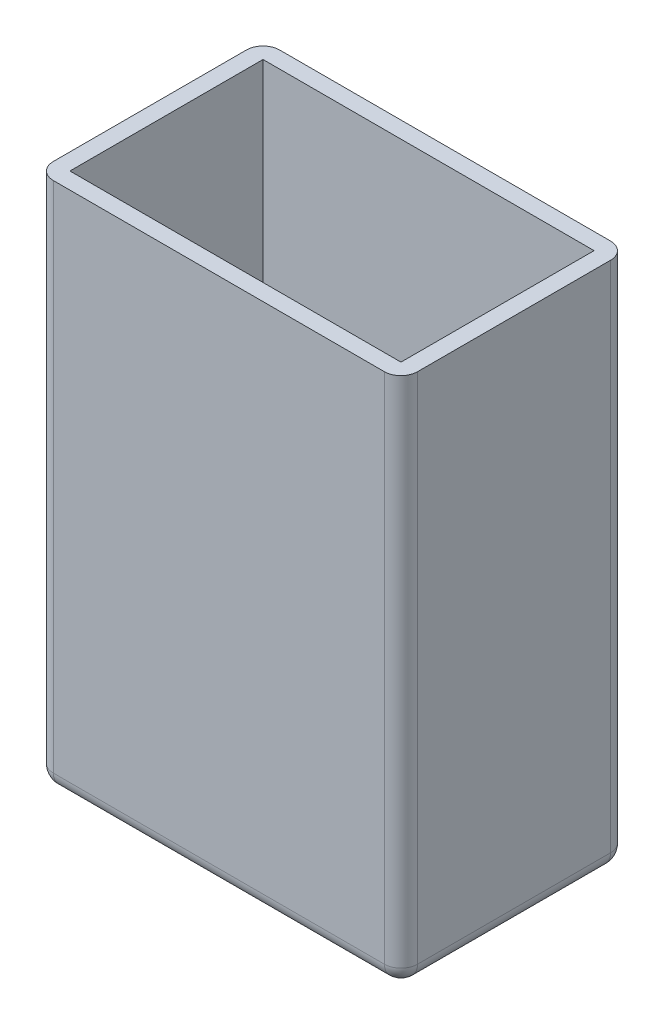
ISO-10303-21;
HEADER;
FILE_DESCRIPTION(('STEP AP214'),'2;1');
FILE_NAME('part.step','',(''),(''),'','','');
FILE_SCHEMA(('AUTOMOTIVE_DESIGN { 1 0 10303 214 1 1 1 1 }'));
ENDSEC;
DATA;
#1=APPLICATION_CONTEXT('core data for automotive mechanical design processes');
#2=APPLICATION_PROTOCOL_DEFINITION('international standard','automotive_design',2000,#1);
#3=PRODUCT_CONTEXT('',#1,'mechanical');
#4=PRODUCT('Part','Part','',(#3));
#5=PRODUCT_RELATED_PRODUCT_CATEGORY('part','',(#4));
#6=PRODUCT_DEFINITION_FORMATION('','',#4);
#7=PRODUCT_DEFINITION_CONTEXT('part definition',#1,'design');
#8=PRODUCT_DEFINITION('design','',#6,#7);
#9=PRODUCT_DEFINITION_SHAPE('','',#8);
#10=(LENGTH_UNIT() NAMED_UNIT(*) SI_UNIT(.MILLI.,.METRE.));
#11=(NAMED_UNIT(*) PLANE_ANGLE_UNIT() SI_UNIT($,.RADIAN.));
#12=(NAMED_UNIT(*) SI_UNIT($,.STERADIAN.) SOLID_ANGLE_UNIT());
#13=UNCERTAINTY_MEASURE_WITH_UNIT(LENGTH_MEASURE(1.E-05),#10,'distance_accuracy_value','');
#14=(GEOMETRIC_REPRESENTATION_CONTEXT(3) GLOBAL_UNCERTAINTY_ASSIGNED_CONTEXT((#13)) GLOBAL_UNIT_ASSIGNED_CONTEXT((#10,
#11,#12)) REPRESENTATION_CONTEXT('',''));
#15=CARTESIAN_POINT('',(0.,0.,0.));
#16=DIRECTION('',(0.,0.,1.));
#17=DIRECTION('',(1.,0.,0.));
#18=AXIS2_PLACEMENT_3D('',#15,#16,#17);
#19=CARTESIAN_POINT('',(0.,0.,3.));
#20=DIRECTION('',(0.,0.,1.));
#21=DIRECTION('',(1.,0.,0.));
#22=AXIS2_PLACEMENT_3D('',#19,#20,#21);
#23=SPHERICAL_SURFACE('',#22,3.);
#24=CARTESIAN_POINT('',(0.,0.,3.));
#25=DIRECTION('',(0.,1.,0.));
#26=DIRECTION('',(0.,0.,1.));
#27=AXIS2_PLACEMENT_3D('',#24,#25,#26);
#28=CIRCLE('',#27,3.);
#29=CARTESIAN_POINT('',(0.,0.,0.));
#30=VERTEX_POINT('',#29);
#31=CARTESIAN_POINT('',(-3.,0.,3.));
#32=VERTEX_POINT('',#31);
#33=EDGE_CURVE('E11',#30,#32,#28,.T.);
#34=ORIENTED_EDGE('',*,*,#33,.F.);
#35=CARTESIAN_POINT('',(0.,0.,3.));
#36=DIRECTION('',(-1.,0.,0.));
#37=DIRECTION('',(0.,0.,1.));
#38=AXIS2_PLACEMENT_3D('',#35,#36,#37);
#39=CIRCLE('',#38,3.);
#40=CARTESIAN_POINT('',(0.,-3.,3.));
#41=VERTEX_POINT('',#40);
#42=EDGE_CURVE('E47',#30,#41,#39,.T.);
#43=ORIENTED_EDGE('',*,*,#42,.T.);
#44=CARTESIAN_POINT('',(0.,0.,3.));
#45=DIRECTION('',(0.,0.,1.));
#46=DIRECTION('',(1.,0.,0.));
#47=AXIS2_PLACEMENT_3D('',#44,#45,#46);
#48=CIRCLE('',#47,3.);
#49=EDGE_CURVE('E263',#32,#41,#48,.T.);
#50=ORIENTED_EDGE('',*,*,#49,.F.);
#51=EDGE_LOOP('',(#34,#43,#50));
#52=FACE_BOUND('',#51,.T.);
#53=ADVANCED_FACE('F39',(#52),#23,.T.);
#54=CARTESIAN_POINT('',(0.,0.,3.));
#55=DIRECTION('',(-1.,0.,0.));
#56=DIRECTION('',(0.,0.,1.));
#57=AXIS2_PLACEMENT_3D('',#54,#55,#56);
#58=CYLINDRICAL_SURFACE('',#57,3.);
#59=ORIENTED_EDGE('',*,*,#42,.F.);
#60=DIRECTION('',(-1.,0.,0.));
#61=VECTOR('',#60,1.);
#62=CARTESIAN_POINT('',(0.,0.,0.));
#63=LINE('',#62,#61);
#64=CARTESIAN_POINT('',(60.,0.,0.));
#65=VERTEX_POINT('',#64);
#66=EDGE_CURVE('E243',#65,#30,#63,.T.);
#67=ORIENTED_EDGE('',*,*,#66,.F.);
#68=CARTESIAN_POINT('',(60.,0.,3.));
#69=DIRECTION('',(-1.,0.,0.));
#70=DIRECTION('',(0.,0.,1.));
#71=AXIS2_PLACEMENT_3D('',#68,#69,#70);
#72=CIRCLE('',#71,3.);
#73=CARTESIAN_POINT('',(60.,-3.,3.));
#74=VERTEX_POINT('',#73);
#75=EDGE_CURVE('E269',#65,#74,#72,.T.);
#76=ORIENTED_EDGE('',*,*,#75,.T.);
#77=DIRECTION('',(-1.,0.,0.));
#78=VECTOR('',#77,1.);
#79=CARTESIAN_POINT('',(63.,-3.,3.));
#80=LINE('',#79,#78);
#81=EDGE_CURVE('E260',#41,#74,#80,.F.);
#82=ORIENTED_EDGE('',*,*,#81,.F.);
#83=EDGE_LOOP('',(#59,#67,#76,#82));
#84=FACE_BOUND('',#83,.T.);
#85=ADVANCED_FACE('F273',(#84),#58,.T.);
#86=CARTESIAN_POINT('',(60.,0.,3.));
#87=DIRECTION('',(0.,0.,1.));
#88=DIRECTION('',(1.,0.,0.));
#89=AXIS2_PLACEMENT_3D('',#86,#87,#88);
#90=SPHERICAL_SURFACE('',#89,3.);
#91=ORIENTED_EDGE('',*,*,#75,.F.);
#92=CARTESIAN_POINT('',(60.,0.,3.));
#93=DIRECTION('',(0.,-1.,0.));
#94=DIRECTION('',(0.,0.,-1.));
#95=AXIS2_PLACEMENT_3D('',#92,#93,#94);
#96=CIRCLE('',#95,3.);
#97=CARTESIAN_POINT('',(63.,0.,3.));
#98=VERTEX_POINT('',#97);
#99=EDGE_CURVE('E267',#65,#98,#96,.T.);
#100=ORIENTED_EDGE('',*,*,#99,.T.);
#101=CARTESIAN_POINT('',(60.,0.,3.));
#102=DIRECTION('',(0.,0.,1.));
#103=DIRECTION('',(1.,0.,0.));
#104=AXIS2_PLACEMENT_3D('',#101,#102,#103);
#105=CIRCLE('',#104,3.);
#106=EDGE_CURVE('E257',#74,#98,#105,.T.);
#107=ORIENTED_EDGE('',*,*,#106,.F.);
#108=EDGE_LOOP('',(#91,#100,#107));
#109=FACE_BOUND('',#108,.T.);
#110=ADVANCED_FACE('F281',(#109),#90,.T.);
#111=CARTESIAN_POINT('',(60.,0.,3.));
#112=DIRECTION('',(0.,-1.,0.));
#113=DIRECTION('',(0.,0.,-1.));
#114=AXIS2_PLACEMENT_3D('',#111,#112,#113);
#115=CYLINDRICAL_SURFACE('',#114,3.);
#116=ORIENTED_EDGE('',*,*,#99,.F.);
#117=DIRECTION('',(0.,-1.,0.));
#118=VECTOR('',#117,1.);
#119=CARTESIAN_POINT('',(60.,0.,0.));
#120=LINE('',#119,#118);
#121=CARTESIAN_POINT('',(60.,93.,0.));
#122=VERTEX_POINT('',#121);
#123=EDGE_CURVE('E246',#122,#65,#120,.T.);
#124=ORIENTED_EDGE('',*,*,#123,.F.);
#125=CARTESIAN_POINT('',(60.,93.,3.));
#126=DIRECTION('',(0.,-1.,0.));
#127=DIRECTION('',(0.,0.,-1.));
#128=AXIS2_PLACEMENT_3D('',#125,#126,#127);
#129=CIRCLE('',#128,3.);
#130=CARTESIAN_POINT('',(63.,93.,3.));
#131=VERTEX_POINT('',#130);
#132=EDGE_CURVE('E255',#131,#122,#129,.F.);
#133=ORIENTED_EDGE('',*,*,#132,.F.);
#134=DIRECTION('',(0.,-1.,0.));
#135=VECTOR('',#134,1.);
#136=CARTESIAN_POINT('',(63.,93.,3.));
#137=LINE('',#136,#135);
#138=EDGE_CURVE('E249',#98,#131,#137,.F.);
#139=ORIENTED_EDGE('',*,*,#138,.F.);
#140=EDGE_LOOP('',(#116,#124,#133,#139));
#141=FACE_BOUND('',#140,.T.);
#142=ADVANCED_FACE('F324',(#141),#115,.T.);
#143=CARTESIAN_POINT('',(0.,0.,3.));
#144=DIRECTION('',(0.,1.,0.));
#145=DIRECTION('',(0.,0.,1.));
#146=AXIS2_PLACEMENT_3D('',#143,#144,#145);
#147=CYLINDRICAL_SURFACE('',#146,3.);
#148=DIRECTION('',(0.,1.,0.));
#149=VECTOR('',#148,1.);
#150=CARTESIAN_POINT('',(0.,0.,0.));
#151=LINE('',#150,#149);
#152=CARTESIAN_POINT('',(0.,93.,0.));
#153=VERTEX_POINT('',#152);
#154=EDGE_CURVE('E240',#30,#153,#151,.T.);
#155=ORIENTED_EDGE('',*,*,#154,.F.);
#156=ORIENTED_EDGE('',*,*,#33,.T.);
#157=DIRECTION('',(0.,1.,0.));
#158=VECTOR('',#157,1.);
#159=CARTESIAN_POINT('',(-3.,-3.,3.));
#160=LINE('',#159,#158);
#161=CARTESIAN_POINT('',(-3.,93.,3.));
#162=VERTEX_POINT('',#161);
#163=EDGE_CURVE('E265',#162,#32,#160,.F.);
#164=ORIENTED_EDGE('',*,*,#163,.F.);
#165=CARTESIAN_POINT('',(0.,93.,3.));
#166=DIRECTION('',(0.,-1.,0.));
#167=DIRECTION('',(0.,0.,-1.));
#168=AXIS2_PLACEMENT_3D('',#165,#166,#167);
#169=CIRCLE('',#168,3.);
#170=EDGE_CURVE('E252',#153,#162,#169,.F.);
#171=ORIENTED_EDGE('',*,*,#170,.F.);
#172=EDGE_LOOP('',(#155,#156,#164,#171));
#173=FACE_BOUND('',#172,.T.);
#174=ADVANCED_FACE('F41',(#173),#147,.T.);
#175=CARTESIAN_POINT('',(60.,0.,38.));
#176=DIRECTION('',(0.,0.,-1.));
#177=DIRECTION('',(-1.,0.,0.));
#178=AXIS2_PLACEMENT_3D('',#175,#176,#177);
#179=SPHERICAL_SURFACE('',#178,3.);
#180=CARTESIAN_POINT('',(60.,0.,38.));
#181=DIRECTION('',(0.,1.,0.));
#182=DIRECTION('',(0.,0.,1.));
#183=AXIS2_PLACEMENT_3D('',#180,#181,#182);
#184=CIRCLE('',#183,3.);
#185=CARTESIAN_POINT('',(60.,0.,41.));
#186=VERTEX_POINT('',#185);
#187=CARTESIAN_POINT('',(63.,0.,38.));
#188=VERTEX_POINT('',#187);
#189=EDGE_CURVE('E238',#186,#188,#184,.T.);
#190=ORIENTED_EDGE('',*,*,#189,.F.);
#191=CARTESIAN_POINT('',(60.,0.,38.));
#192=DIRECTION('',(1.,0.,0.));
#193=DIRECTION('',(0.,0.,-1.));
#194=AXIS2_PLACEMENT_3D('',#191,#192,#193);
#195=CIRCLE('',#194,3.);
#196=CARTESIAN_POINT('',(60.,-3.,38.));
#197=VERTEX_POINT('',#196);
#198=EDGE_CURVE('E235',#186,#197,#195,.T.);
#199=ORIENTED_EDGE('',*,*,#198,.T.);
#200=CARTESIAN_POINT('',(60.,0.,38.));
#201=DIRECTION('',(0.,0.,1.));
#202=DIRECTION('',(1.,0.,0.));
#203=AXIS2_PLACEMENT_3D('',#200,#201,#202);
#204=CIRCLE('',#203,3.);
#205=EDGE_CURVE('E224',#188,#197,#204,.F.);
#206=ORIENTED_EDGE('',*,*,#205,.F.);
#207=EDGE_LOOP('',(#190,#199,#206));
#208=FACE_BOUND('',#207,.T.);
#209=ADVANCED_FACE('F331',(#208),#179,.T.);
#210=CARTESIAN_POINT('',(0.,0.,38.));
#211=DIRECTION('',(1.,0.,0.));
#212=DIRECTION('',(0.,0.,-1.));
#213=AXIS2_PLACEMENT_3D('',#210,#211,#212);
#214=CYLINDRICAL_SURFACE('',#213,3.);
#215=ORIENTED_EDGE('',*,*,#198,.F.);
#216=DIRECTION('',(1.,0.,0.));
#217=VECTOR('',#216,1.);
#218=CARTESIAN_POINT('',(0.,0.,41.));
#219=LINE('',#218,#217);
#220=CARTESIAN_POINT('',(0.,0.,41.));
#221=VERTEX_POINT('',#220);
#222=EDGE_CURVE('E204',#221,#186,#219,.T.);
#223=ORIENTED_EDGE('',*,*,#222,.F.);
#224=CARTESIAN_POINT('',(0.,0.,38.));
#225=DIRECTION('',(1.,0.,0.));
#226=DIRECTION('',(0.,0.,-1.));
#227=AXIS2_PLACEMENT_3D('',#224,#225,#226);
#228=CIRCLE('',#227,3.);
#229=CARTESIAN_POINT('',(0.,-3.,38.));
#230=VERTEX_POINT('',#229);
#231=EDGE_CURVE('E233',#221,#230,#228,.T.);
#232=ORIENTED_EDGE('',*,*,#231,.T.);
#233=DIRECTION('',(1.,0.,0.));
#234=VECTOR('',#233,1.);
#235=CARTESIAN_POINT('',(63.,-3.,38.));
#236=LINE('',#235,#234);
#237=EDGE_CURVE('E221',#197,#230,#236,.F.);
#238=ORIENTED_EDGE('',*,*,#237,.F.);
#239=EDGE_LOOP('',(#215,#223,#232,#238));
#240=FACE_BOUND('',#239,.T.);
#241=ADVANCED_FACE('F291',(#240),#214,.T.);
#242=CARTESIAN_POINT('',(0.,0.,38.));
#243=DIRECTION('',(0.,0.,-1.));
#244=DIRECTION('',(-1.,0.,0.));
#245=AXIS2_PLACEMENT_3D('',#242,#243,#244);
#246=SPHERICAL_SURFACE('',#245,3.);
#247=ORIENTED_EDGE('',*,*,#231,.F.);
#248=CARTESIAN_POINT('',(0.,0.,38.));
#249=DIRECTION('',(0.,-1.,0.));
#250=DIRECTION('',(0.,0.,-1.));
#251=AXIS2_PLACEMENT_3D('',#248,#249,#250);
#252=CIRCLE('',#251,3.);
#253=CARTESIAN_POINT('',(-3.,0.,38.));
#254=VERTEX_POINT('',#253);
#255=EDGE_CURVE('E230',#221,#254,#252,.T.);
#256=ORIENTED_EDGE('',*,*,#255,.T.);
#257=CARTESIAN_POINT('',(0.,0.,38.));
#258=DIRECTION('',(0.,0.,1.));
#259=DIRECTION('',(1.,0.,0.));
#260=AXIS2_PLACEMENT_3D('',#257,#258,#259);
#261=CIRCLE('',#260,3.);
#262=EDGE_CURVE('E218',#230,#254,#261,.F.);
#263=ORIENTED_EDGE('',*,*,#262,.F.);
#264=EDGE_LOOP('',(#247,#256,#263));
#265=FACE_BOUND('',#264,.T.);
#266=ADVANCED_FACE('F295',(#265),#246,.T.);
#267=CARTESIAN_POINT('',(0.,0.,38.));
#268=DIRECTION('',(0.,-1.,0.));
#269=DIRECTION('',(0.,0.,-1.));
#270=AXIS2_PLACEMENT_3D('',#267,#268,#269);
#271=CYLINDRICAL_SURFACE('',#270,3.);
#272=ORIENTED_EDGE('',*,*,#255,.F.);
#273=DIRECTION('',(0.,-1.,0.));
#274=VECTOR('',#273,1.);
#275=CARTESIAN_POINT('',(0.,0.,41.));
#276=LINE('',#275,#274);
#277=CARTESIAN_POINT('',(0.,93.,41.));
#278=VERTEX_POINT('',#277);
#279=EDGE_CURVE('E207',#278,#221,#276,.T.);
#280=ORIENTED_EDGE('',*,*,#279,.F.);
#281=CARTESIAN_POINT('',(0.,93.,38.));
#282=DIRECTION('',(0.,-1.,0.));
#283=DIRECTION('',(0.,0.,-1.));
#284=AXIS2_PLACEMENT_3D('',#281,#282,#283);
#285=CIRCLE('',#284,3.);
#286=CARTESIAN_POINT('',(-3.,93.,38.));
#287=VERTEX_POINT('',#286);
#288=EDGE_CURVE('E216',#287,#278,#285,.F.);
#289=ORIENTED_EDGE('',*,*,#288,.F.);
#290=DIRECTION('',(0.,-1.,0.));
#291=VECTOR('',#290,1.);
#292=CARTESIAN_POINT('',(-3.,-3.,38.));
#293=LINE('',#292,#291);
#294=EDGE_CURVE('E210',#254,#287,#293,.F.);
#295=ORIENTED_EDGE('',*,*,#294,.F.);
#296=EDGE_LOOP('',(#272,#280,#289,#295));
#297=FACE_BOUND('',#296,.T.);
#298=ADVANCED_FACE('F310',(#297),#271,.T.);
#299=CARTESIAN_POINT('',(60.,0.,38.));
#300=DIRECTION('',(0.,1.,0.));
#301=DIRECTION('',(0.,0.,1.));
#302=AXIS2_PLACEMENT_3D('',#299,#300,#301);
#303=CYLINDRICAL_SURFACE('',#302,3.);
#304=DIRECTION('',(0.,1.,0.));
#305=VECTOR('',#304,1.);
#306=CARTESIAN_POINT('',(60.,0.,41.));
#307=LINE('',#306,#305);
#308=CARTESIAN_POINT('',(60.,93.,41.));
#309=VERTEX_POINT('',#308);
#310=EDGE_CURVE('E201',#186,#309,#307,.T.);
#311=ORIENTED_EDGE('',*,*,#310,.F.);
#312=ORIENTED_EDGE('',*,*,#189,.T.);
#313=DIRECTION('',(0.,1.,0.));
#314=VECTOR('',#313,1.);
#315=CARTESIAN_POINT('',(63.,93.,38.));
#316=LINE('',#315,#314);
#317=CARTESIAN_POINT('',(63.,93.,38.));
#318=VERTEX_POINT('',#317);
#319=EDGE_CURVE('E227',#318,#188,#316,.F.);
#320=ORIENTED_EDGE('',*,*,#319,.F.);
#321=CARTESIAN_POINT('',(60.,93.,38.));
#322=DIRECTION('',(0.,-1.,0.));
#323=DIRECTION('',(0.,0.,-1.));
#324=AXIS2_PLACEMENT_3D('',#321,#322,#323);
#325=CIRCLE('',#324,3.);
#326=EDGE_CURVE('E213',#309,#318,#325,.F.);
#327=ORIENTED_EDGE('',*,*,#326,.F.);
#328=EDGE_LOOP('',(#311,#312,#320,#327));
#329=FACE_BOUND('',#328,.T.);
#330=ADVANCED_FACE('F320',(#329),#303,.T.);
#331=CARTESIAN_POINT('',(60.,0.,38.));
#332=DIRECTION('',(0.,0.,1.));
#333=DIRECTION('',(1.,0.,0.));
#334=AXIS2_PLACEMENT_3D('',#331,#332,#333);
#335=CYLINDRICAL_SURFACE('',#334,3.);
#336=DIRECTION('',(0.,0.,1.));
#337=VECTOR('',#336,1.);
#338=CARTESIAN_POINT('',(60.,-3.,38.));
#339=LINE('',#338,#337);
#340=EDGE_CURVE('E196',#74,#197,#339,.T.);
#341=ORIENTED_EDGE('',*,*,#340,.F.);
#342=ORIENTED_EDGE('',*,*,#106,.T.);
#343=DIRECTION('',(0.,0.,1.));
#344=VECTOR('',#343,1.);
#345=CARTESIAN_POINT('',(63.,0.,38.));
#346=LINE('',#345,#344);
#347=EDGE_CURVE('E198',#188,#98,#346,.F.);
#348=ORIENTED_EDGE('',*,*,#347,.F.);
#349=ORIENTED_EDGE('',*,*,#205,.T.);
#350=EDGE_LOOP('',(#341,#342,#348,#349));
#351=FACE_BOUND('',#350,.T.);
#352=ADVANCED_FACE('F285',(#351),#335,.T.);
#353=CARTESIAN_POINT('',(0.,0.,38.));
#354=DIRECTION('',(0.,0.,1.));
#355=DIRECTION('',(1.,0.,0.));
#356=AXIS2_PLACEMENT_3D('',#353,#354,#355);
#357=CYLINDRICAL_SURFACE('',#356,3.);
#358=DIRECTION('',(0.,0.,1.));
#359=VECTOR('',#358,1.);
#360=CARTESIAN_POINT('',(-3.,0.,38.));
#361=LINE('',#360,#359);
#362=EDGE_CURVE('E191',#32,#254,#361,.T.);
#363=ORIENTED_EDGE('',*,*,#362,.F.);
#364=ORIENTED_EDGE('',*,*,#49,.T.);
#365=DIRECTION('',(0.,0.,1.));
#366=VECTOR('',#365,1.);
#367=CARTESIAN_POINT('',(0.,-3.,38.));
#368=LINE('',#367,#366);
#369=EDGE_CURVE('E193',#230,#41,#368,.F.);
#370=ORIENTED_EDGE('',*,*,#369,.F.);
#371=ORIENTED_EDGE('',*,*,#262,.T.);
#372=EDGE_LOOP('',(#363,#364,#370,#371));
#373=FACE_BOUND('',#372,.T.);
#374=ADVANCED_FACE('F300',(#373),#357,.T.);
#375=CARTESIAN_POINT('',(0.,0.,3.));
#376=DIRECTION('',(0.,0.,1.));
#377=DIRECTION('',(1.,0.,0.));
#378=AXIS2_PLACEMENT_3D('',#375,#376,#377);
#379=PLANE('',#378);
#380=DIRECTION('',(1.,0.,0.));
#381=VECTOR('',#380,1.);
#382=CARTESIAN_POINT('',(0.,0.,3.));
#383=LINE('',#382,#381);
#384=CARTESIAN_POINT('',(0.,0.,3.));
#385=VERTEX_POINT('',#384);
#386=CARTESIAN_POINT('',(60.,0.,3.));
#387=VERTEX_POINT('',#386);
#388=EDGE_CURVE('E183',#385,#387,#383,.T.);
#389=ORIENTED_EDGE('',*,*,#388,.T.);
#390=DIRECTION('',(0.,1.,0.));
#391=VECTOR('',#390,1.);
#392=CARTESIAN_POINT('',(60.,0.,3.));
#393=LINE('',#392,#391);
#394=CARTESIAN_POINT('',(60.,93.,3.));
#395=VERTEX_POINT('',#394);
#396=EDGE_CURVE('E186',#387,#395,#393,.T.);
#397=ORIENTED_EDGE('',*,*,#396,.T.);
#398=DIRECTION('',(-1.,0.,0.));
#399=VECTOR('',#398,1.);
#400=CARTESIAN_POINT('',(60.,93.,3.));
#401=LINE('',#400,#399);
#402=CARTESIAN_POINT('',(0.,93.,3.));
#403=VERTEX_POINT('',#402);
#404=EDGE_CURVE('E162',#395,#403,#401,.T.);
#405=ORIENTED_EDGE('',*,*,#404,.T.);
#406=DIRECTION('',(0.,-1.,0.));
#407=VECTOR('',#406,1.);
#408=CARTESIAN_POINT('',(0.,0.,3.));
#409=LINE('',#408,#407);
#410=EDGE_CURVE('E188',#403,#385,#409,.T.);
#411=ORIENTED_EDGE('',*,*,#410,.T.);
#412=EDGE_LOOP('',(#389,#397,#405,#411));
#413=FACE_BOUND('',#412,.T.);
#414=ADVANCED_FACE('F373',(#413),#379,.T.);
#415=CARTESIAN_POINT('',(63.,-3.,38.));
#416=DIRECTION('',(0.,1.,0.));
#417=DIRECTION('',(0.,0.,1.));
#418=AXIS2_PLACEMENT_3D('',#415,#416,#417);
#419=PLANE('',#418);
#420=ORIENTED_EDGE('',*,*,#369,.T.);
#421=ORIENTED_EDGE('',*,*,#81,.T.);
#422=ORIENTED_EDGE('',*,*,#340,.T.);
#423=ORIENTED_EDGE('',*,*,#237,.T.);
#424=EDGE_LOOP('',(#420,#421,#422,#423));
#425=FACE_BOUND('',#424,.T.);
#426=ADVANCED_FACE('F278',(#425),#419,.F.);
#427=CARTESIAN_POINT('',(63.,93.,38.));
#428=DIRECTION('',(-1.,0.,0.));
#429=DIRECTION('',(0.,0.,1.));
#430=AXIS2_PLACEMENT_3D('',#427,#428,#429);
#431=PLANE('',#430);
#432=ORIENTED_EDGE('',*,*,#347,.T.);
#433=ORIENTED_EDGE('',*,*,#138,.T.);
#434=DIRECTION('',(0.,0.,-1.));
#435=VECTOR('',#434,1.);
#436=CARTESIAN_POINT('',(63.,93.,38.));
#437=LINE('',#436,#435);
#438=EDGE_CURVE('E180',#318,#131,#437,.T.);
#439=ORIENTED_EDGE('',*,*,#438,.F.);
#440=ORIENTED_EDGE('',*,*,#319,.T.);
#441=EDGE_LOOP('',(#432,#433,#439,#440));
#442=FACE_BOUND('',#441,.T.);
#443=ADVANCED_FACE('F322',(#442),#431,.F.);
#444=CARTESIAN_POINT('',(-3.,93.,38.));
#445=DIRECTION('',(0.,-1.,0.));
#446=DIRECTION('',(0.,0.,-1.));
#447=AXIS2_PLACEMENT_3D('',#444,#445,#446);
#448=PLANE('',#447);
#449=ORIENTED_EDGE('',*,*,#438,.T.);
#450=ORIENTED_EDGE('',*,*,#132,.T.);
#451=DIRECTION('',(-1.,0.,0.));
#452=VECTOR('',#451,1.);
#453=CARTESIAN_POINT('',(-3.,93.,0.));
#454=LINE('',#453,#452);
#455=EDGE_CURVE('E174',#122,#153,#454,.T.);
#456=ORIENTED_EDGE('',*,*,#455,.T.);
#457=ORIENTED_EDGE('',*,*,#170,.T.);
#458=DIRECTION('',(0.,0.,-1.));
#459=VECTOR('',#458,1.);
#460=CARTESIAN_POINT('',(-3.,93.,38.));
#461=LINE('',#460,#459);
#462=EDGE_CURVE('E177',#287,#162,#461,.T.);
#463=ORIENTED_EDGE('',*,*,#462,.F.);
#464=ORIENTED_EDGE('',*,*,#288,.T.);
#465=DIRECTION('',(-1.,0.,0.));
#466=VECTOR('',#465,1.);
#467=CARTESIAN_POINT('',(-3.,93.,41.));
#468=LINE('',#467,#466);
#469=EDGE_CURVE('E148',#309,#278,#468,.T.);
#470=ORIENTED_EDGE('',*,*,#469,.F.);
#471=ORIENTED_EDGE('',*,*,#326,.T.);
#472=EDGE_LOOP('',(#449,#450,#456,#457,#463,#464,#470,#471));
#473=FACE_BOUND('',#472,.T.);
#474=DIRECTION('',(-1.,0.,0.));
#475=VECTOR('',#474,1.);
#476=CARTESIAN_POINT('',(-3.,93.,38.));
#477=LINE('',#476,#475);
#478=CARTESIAN_POINT('',(60.,93.,38.));
#479=VERTEX_POINT('',#478);
#480=CARTESIAN_POINT('',(0.,93.,38.));
#481=VERTEX_POINT('',#480);
#482=EDGE_CURVE('E137',#479,#481,#477,.T.);
#483=ORIENTED_EDGE('',*,*,#482,.T.);
#484=DIRECTION('',(0.,0.,1.));
#485=VECTOR('',#484,1.);
#486=CARTESIAN_POINT('',(0.,93.,3.));
#487=LINE('',#486,#485);
#488=EDGE_CURVE('E163',#403,#481,#487,.T.);
#489=ORIENTED_EDGE('',*,*,#488,.F.);
#490=ORIENTED_EDGE('',*,*,#404,.F.);
#491=DIRECTION('',(0.,0.,1.));
#492=VECTOR('',#491,1.);
#493=CARTESIAN_POINT('',(60.,93.,3.));
#494=LINE('',#493,#492);
#495=EDGE_CURVE('E154',#395,#479,#494,.T.);
#496=ORIENTED_EDGE('',*,*,#495,.T.);
#497=EDGE_LOOP('',(#483,#489,#490,#496));
#498=FACE_BOUND('',#497,.T.);
#499=ADVANCED_FACE('F160',(#473,#498),#448,.F.);
#500=CARTESIAN_POINT('',(-3.,-3.,38.));
#501=DIRECTION('',(1.,0.,0.));
#502=DIRECTION('',(0.,0.,-1.));
#503=AXIS2_PLACEMENT_3D('',#500,#501,#502);
#504=PLANE('',#503);
#505=ORIENTED_EDGE('',*,*,#462,.T.);
#506=ORIENTED_EDGE('',*,*,#163,.T.);
#507=ORIENTED_EDGE('',*,*,#362,.T.);
#508=ORIENTED_EDGE('',*,*,#294,.T.);
#509=EDGE_LOOP('',(#505,#506,#507,#508));
#510=FACE_BOUND('',#509,.T.);
#511=ADVANCED_FACE('F308',(#510),#504,.F.);
#512=CARTESIAN_POINT('',(0.,90.,38.));
#513=DIRECTION('',(1.,0.,0.));
#514=DIRECTION('',(0.,0.,-1.));
#515=AXIS2_PLACEMENT_3D('',#512,#513,#514);
#516=PLANE('',#515);
#517=DIRECTION('',(0.,0.,-1.));
#518=VECTOR('',#517,1.);
#519=CARTESIAN_POINT('',(0.,0.,38.));
#520=LINE('',#519,#518);
#521=CARTESIAN_POINT('',(0.,0.,38.));
#522=VERTEX_POINT('',#521);
#523=EDGE_CURVE('E171',#522,#385,#520,.T.);
#524=ORIENTED_EDGE('',*,*,#523,.T.);
#525=ORIENTED_EDGE('',*,*,#410,.F.);
#526=ORIENTED_EDGE('',*,*,#488,.T.);
#527=DIRECTION('',(0.,-1.,0.));
#528=VECTOR('',#527,1.);
#529=CARTESIAN_POINT('',(0.,90.,38.));
#530=LINE('',#529,#528);
#531=EDGE_CURVE('E143',#481,#522,#530,.T.);
#532=ORIENTED_EDGE('',*,*,#531,.T.);
#533=EDGE_LOOP('',(#524,#525,#526,#532));
#534=FACE_BOUND('',#533,.T.);
#535=ADVANCED_FACE('F404',(#534),#516,.T.);
#536=CARTESIAN_POINT('',(0.,0.,38.));
#537=DIRECTION('',(0.,1.,0.));
#538=DIRECTION('',(-1.,0.,0.));
#539=AXIS2_PLACEMENT_3D('',#536,#537,#538);
#540=PLANE('',#539);
#541=DIRECTION('',(0.,0.,-1.));
#542=VECTOR('',#541,1.);
#543=CARTESIAN_POINT('',(60.,0.,38.));
#544=LINE('',#543,#542);
#545=CARTESIAN_POINT('',(60.,0.,38.));
#546=VERTEX_POINT('',#545);
#547=EDGE_CURVE('E157',#546,#387,#544,.T.);
#548=ORIENTED_EDGE('',*,*,#547,.T.);
#549=ORIENTED_EDGE('',*,*,#388,.F.);
#550=ORIENTED_EDGE('',*,*,#523,.F.);
#551=DIRECTION('',(1.,0.,0.));
#552=VECTOR('',#551,1.);
#553=CARTESIAN_POINT('',(0.,0.,38.));
#554=LINE('',#553,#552);
#555=EDGE_CURVE('E158',#522,#546,#554,.T.);
#556=ORIENTED_EDGE('',*,*,#555,.T.);
#557=EDGE_LOOP('',(#548,#549,#550,#556));
#558=FACE_BOUND('',#557,.T.);
#559=ADVANCED_FACE('F440',(#558),#540,.T.);
#560=CARTESIAN_POINT('',(60.,0.,38.));
#561=DIRECTION('',(-1.,0.,0.));
#562=DIRECTION('',(0.,0.,1.));
#563=AXIS2_PLACEMENT_3D('',#560,#561,#562);
#564=PLANE('',#563);
#565=DIRECTION('',(0.,1.,0.));
#566=VECTOR('',#565,1.);
#567=CARTESIAN_POINT('',(60.,0.,38.));
#568=LINE('',#567,#566);
#569=EDGE_CURVE('E140',#546,#479,#568,.T.);
#570=ORIENTED_EDGE('',*,*,#569,.T.);
#571=ORIENTED_EDGE('',*,*,#495,.F.);
#572=ORIENTED_EDGE('',*,*,#396,.F.);
#573=ORIENTED_EDGE('',*,*,#547,.F.);
#574=EDGE_LOOP('',(#570,#571,#572,#573));
#575=FACE_BOUND('',#574,.T.);
#576=ADVANCED_FACE('F153',(#575),#564,.T.);
#577=CARTESIAN_POINT('',(0.,0.,0.));
#578=DIRECTION('',(0.,0.,1.));
#579=DIRECTION('',(1.,0.,0.));
#580=AXIS2_PLACEMENT_3D('',#577,#578,#579);
#581=PLANE('',#580);
#582=ORIENTED_EDGE('',*,*,#455,.F.);
#583=ORIENTED_EDGE('',*,*,#123,.T.);
#584=ORIENTED_EDGE('',*,*,#66,.T.);
#585=ORIENTED_EDGE('',*,*,#154,.T.);
#586=EDGE_LOOP('',(#582,#583,#584,#585));
#587=FACE_BOUND('',#586,.T.);
#588=ADVANCED_FACE('F303',(#587),#581,.F.);
#589=CARTESIAN_POINT('',(0.,0.,38.));
#590=DIRECTION('',(0.,0.,-1.));
#591=DIRECTION('',(-1.,0.,0.));
#592=AXIS2_PLACEMENT_3D('',#589,#590,#591);
#593=PLANE('',#592);
#594=ORIENTED_EDGE('',*,*,#531,.F.);
#595=ORIENTED_EDGE('',*,*,#482,.F.);
#596=ORIENTED_EDGE('',*,*,#569,.F.);
#597=ORIENTED_EDGE('',*,*,#555,.F.);
#598=EDGE_LOOP('',(#594,#595,#596,#597));
#599=FACE_BOUND('',#598,.T.);
#600=ADVANCED_FACE('F139',(#599),#593,.T.);
#601=CARTESIAN_POINT('',(0.,0.,41.));
#602=DIRECTION('',(0.,0.,-1.));
#603=DIRECTION('',(-1.,0.,0.));
#604=AXIS2_PLACEMENT_3D('',#601,#602,#603);
#605=PLANE('',#604);
#606=ORIENTED_EDGE('',*,*,#469,.T.);
#607=ORIENTED_EDGE('',*,*,#279,.T.);
#608=ORIENTED_EDGE('',*,*,#222,.T.);
#609=ORIENTED_EDGE('',*,*,#310,.T.);
#610=EDGE_LOOP('',(#606,#607,#608,#609));
#611=FACE_BOUND('',#610,.T.);
#612=ADVANCED_FACE('F317',(#611),#605,.F.);
#613=CLOSED_SHELL('',(#53,#85,#110,#142,#174,#209,#241,#266,#298,#330,#352,#374,#414,#426,#443,
#499,#511,#535,#559,#576,#588,#600,#612));
#614=MANIFOLD_SOLID_BREP('B2',#613);
#615=ADVANCED_BREP_SHAPE_REPRESENTATION('',(#18,#614),#14);
#616=SHAPE_DEFINITION_REPRESENTATION(#9,#615);
ENDSEC;
END-ISO-10303-21;
